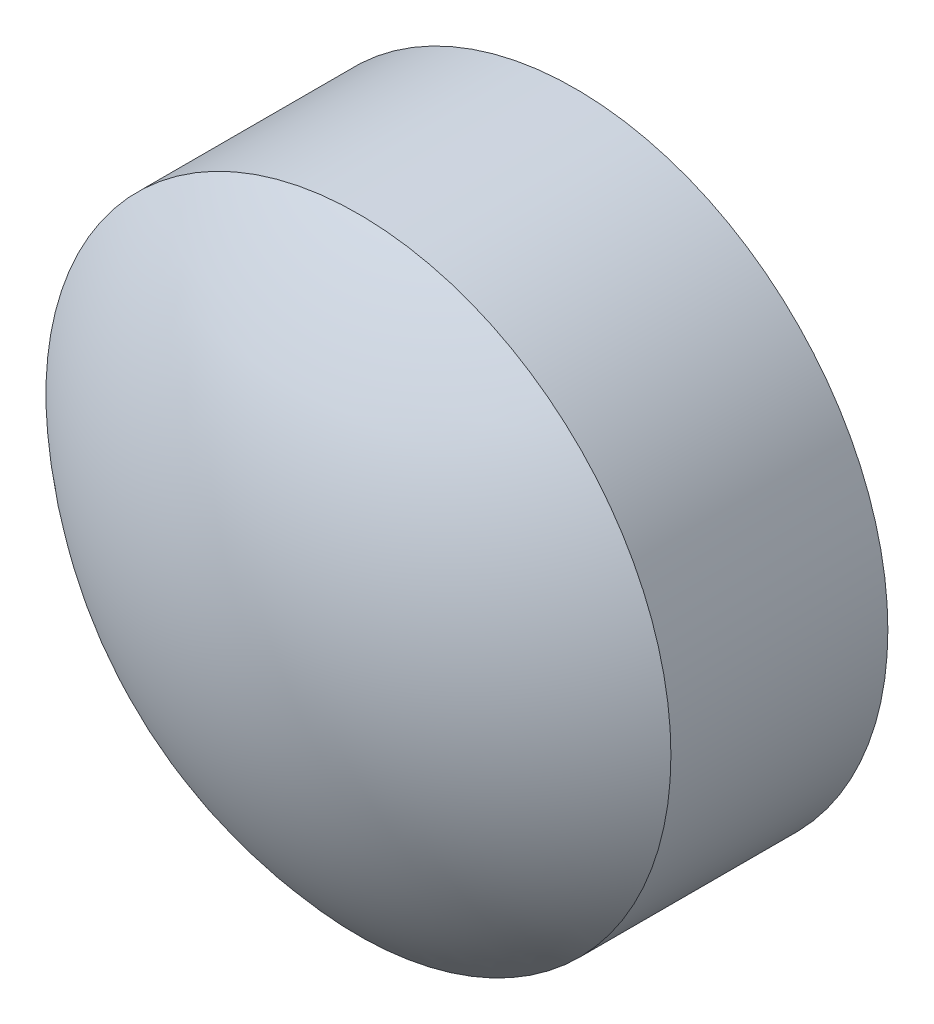
ISO-10303-21;
HEADER;
FILE_DESCRIPTION(('STEP AP214'),'2;1');
FILE_NAME('part.step','',(''),(''),'','','');
FILE_SCHEMA(('AUTOMOTIVE_DESIGN { 1 0 10303 214 1 1 1 1 }'));
ENDSEC;
DATA;
#1=APPLICATION_CONTEXT('core data for automotive mechanical design processes');
#2=APPLICATION_PROTOCOL_DEFINITION('international standard','automotive_design',2000,#1);
#3=PRODUCT_CONTEXT('',#1,'mechanical');
#4=PRODUCT('Part','Part','',(#3));
#5=PRODUCT_RELATED_PRODUCT_CATEGORY('part','',(#4));
#6=PRODUCT_DEFINITION_FORMATION('','',#4);
#7=PRODUCT_DEFINITION_CONTEXT('part definition',#1,'design');
#8=PRODUCT_DEFINITION('design','',#6,#7);
#9=PRODUCT_DEFINITION_SHAPE('','',#8);
#10=(LENGTH_UNIT() NAMED_UNIT(*) SI_UNIT(.MILLI.,.METRE.));
#11=(NAMED_UNIT(*) PLANE_ANGLE_UNIT() SI_UNIT($,.RADIAN.));
#12=(NAMED_UNIT(*) SI_UNIT($,.STERADIAN.) SOLID_ANGLE_UNIT());
#13=UNCERTAINTY_MEASURE_WITH_UNIT(LENGTH_MEASURE(1.E-05),#10,'distance_accuracy_value','');
#14=(GEOMETRIC_REPRESENTATION_CONTEXT(3) GLOBAL_UNCERTAINTY_ASSIGNED_CONTEXT((#13)) GLOBAL_UNIT_ASSIGNED_CONTEXT((#10,
#11,#12)) REPRESENTATION_CONTEXT('',''));
#15=CARTESIAN_POINT('',(0.,0.,0.));
#16=DIRECTION('',(0.,0.,1.));
#17=DIRECTION('',(1.,0.,0.));
#18=AXIS2_PLACEMENT_3D('',#15,#16,#17);
#19=CARTESIAN_POINT('',(0.,0.,-0.229999999999998));
#20=DIRECTION('',(0.,-1.,0.));
#21=DIRECTION('',(0.,0.,1.));
#22=AXIS2_PLACEMENT_3D('',#19,#20,#21);
#23=SPHERICAL_SURFACE('',#22,2.23);
#24=CARTESIAN_POINT('',(0.,0.,1.4201212076693));
#25=DIRECTION('',(0.,0.,1.));
#26=DIRECTION('',(1.,0.,0.));
#27=AXIS2_PLACEMENT_3D('',#24,#25,#26);
#28=CIRCLE('',#27,1.5);
#29=CARTESIAN_POINT('',(1.5,0.,1.4201212076693));
#30=VERTEX_POINT('',#29);
#31=EDGE_CURVE('E19',#30,#30,#28,.F.);
#32=ORIENTED_EDGE('',*,*,#31,.F.);
#33=EDGE_LOOP('',(#32));
#34=FACE_BOUND('',#33,.T.);
#35=ADVANCED_FACE('F15',(#34),#23,.T.);
#36=CARTESIAN_POINT('',(0.,0.,3.16));
#37=DIRECTION('',(0.,-1.,0.));
#38=DIRECTION('',(0.,0.,-1.));
#39=AXIS2_PLACEMENT_3D('',#36,#37,#38);
#40=SPHERICAL_SURFACE('',#39,3.16);
#41=CARTESIAN_POINT('',(0.,0.,0.378705337437258));
#42=DIRECTION('',(0.,0.,1.));
#43=DIRECTION('',(1.,0.,0.));
#44=AXIS2_PLACEMENT_3D('',#41,#42,#43);
#45=CIRCLE('',#44,1.5);
#46=CARTESIAN_POINT('',(1.5,0.,0.378705337437258));
#47=VERTEX_POINT('',#46);
#48=EDGE_CURVE('E10',#47,#47,#45,.T.);
#49=ORIENTED_EDGE('',*,*,#48,.F.);
#50=EDGE_LOOP('',(#49));
#51=FACE_BOUND('',#50,.T.);
#52=ADVANCED_FACE('F32',(#51),#40,.T.);
#53=CARTESIAN_POINT('',(0.,0.,0.378705337437258));
#54=DIRECTION('',(0.,0.,1.));
#55=DIRECTION('',(1.,0.,0.));
#56=AXIS2_PLACEMENT_3D('',#53,#54,#55);
#57=CYLINDRICAL_SURFACE('',#56,1.5);
#58=ORIENTED_EDGE('',*,*,#48,.T.);
#59=EDGE_LOOP('',(#58));
#60=FACE_BOUND('',#59,.T.);
#61=ORIENTED_EDGE('',*,*,#31,.T.);
#62=EDGE_LOOP('',(#61));
#63=FACE_BOUND('',#62,.T.);
#64=ADVANCED_FACE('F35',(#60,#63),#57,.T.);
#65=CLOSED_SHELL('',(#35,#52,#64));
#66=MANIFOLD_SOLID_BREP('B1',#65);
#67=ADVANCED_BREP_SHAPE_REPRESENTATION('',(#18,#66),#14);
#68=SHAPE_DEFINITION_REPRESENTATION(#9,#67);
ENDSEC;
END-ISO-10303-21;
